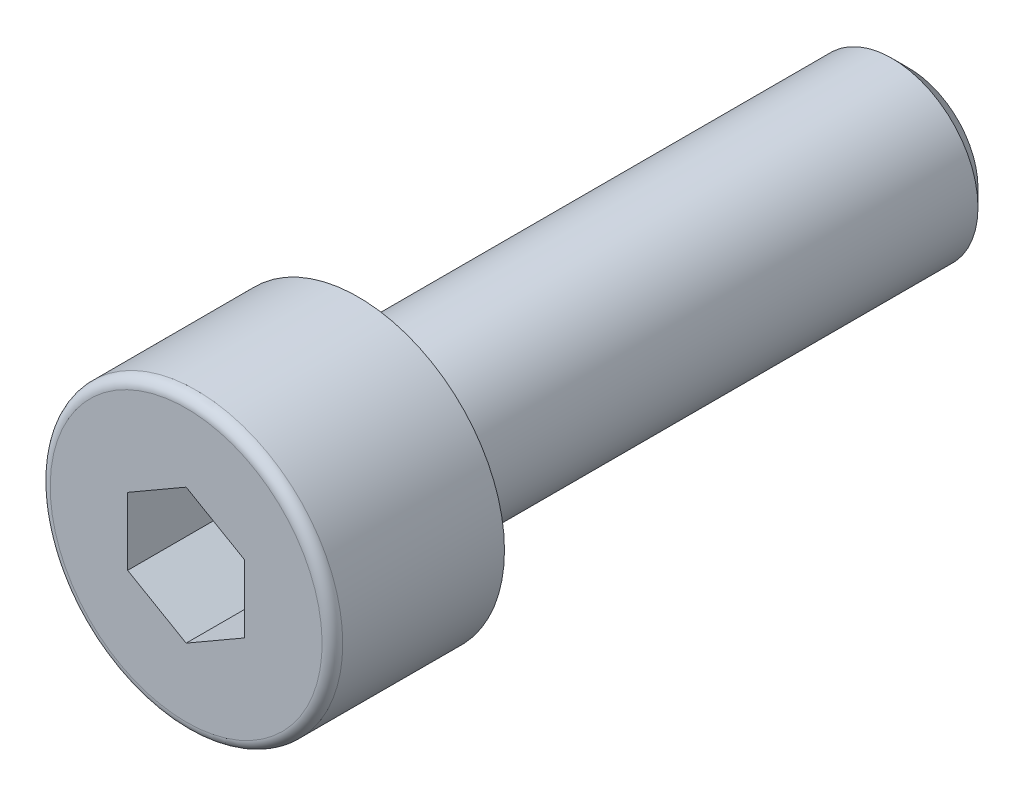
ISO-10303-21;
HEADER;
FILE_DESCRIPTION(('STEP AP214'),'2;1');
FILE_NAME('part.step','',(''),(''),'','','');
FILE_SCHEMA(('AUTOMOTIVE_DESIGN { 1 0 10303 214 1 1 1 1 }'));
ENDSEC;
DATA;
#1=APPLICATION_CONTEXT('core data for automotive mechanical design processes');
#2=APPLICATION_PROTOCOL_DEFINITION('international standard','automotive_design',2000,#1);
#3=PRODUCT_CONTEXT('',#1,'mechanical');
#4=PRODUCT('Part','Part','',(#3));
#5=PRODUCT_RELATED_PRODUCT_CATEGORY('part','',(#4));
#6=PRODUCT_DEFINITION_FORMATION('','',#4);
#7=PRODUCT_DEFINITION_CONTEXT('part definition',#1,'design');
#8=PRODUCT_DEFINITION('design','',#6,#7);
#9=PRODUCT_DEFINITION_SHAPE('','',#8);
#10=(LENGTH_UNIT() NAMED_UNIT(*) SI_UNIT(.MILLI.,.METRE.));
#11=(NAMED_UNIT(*) PLANE_ANGLE_UNIT() SI_UNIT($,.RADIAN.));
#12=(NAMED_UNIT(*) SI_UNIT($,.STERADIAN.) SOLID_ANGLE_UNIT());
#13=UNCERTAINTY_MEASURE_WITH_UNIT(LENGTH_MEASURE(1.E-05),#10,'distance_accuracy_value','');
#14=(GEOMETRIC_REPRESENTATION_CONTEXT(3) GLOBAL_UNCERTAINTY_ASSIGNED_CONTEXT((#13)) GLOBAL_UNIT_ASSIGNED_CONTEXT((#10,
#11,#12)) REPRESENTATION_CONTEXT('',''));
#15=CARTESIAN_POINT('',(0.,0.,0.));
#16=DIRECTION('',(0.,0.,1.));
#17=DIRECTION('',(1.,0.,0.));
#18=AXIS2_PLACEMENT_3D('',#15,#16,#17);
#19=CARTESIAN_POINT('',(-236.8,766.037009084756,-4.));
#20=DIRECTION('',(0.,0.,1.));
#21=DIRECTION('',(1.,0.,0.));
#22=AXIS2_PLACEMENT_3D('',#19,#20,#21);
#23=PLANE('',#22);
#24=DIRECTION('',(0.866025403784444,0.499999999999991,0.));
#25=VECTOR('',#24,1.);
#26=CARTESIAN_POINT('',(-238.5,769.962990915245,-4.));
#27=LINE('',#26,#25);
#28=CARTESIAN_POINT('',(-240.2,768.981495457623,-4.));
#29=VERTEX_POINT('',#28);
#30=CARTESIAN_POINT('',(-238.5,769.962990915245,-4.));
#31=VERTEX_POINT('',#30);
#32=EDGE_CURVE('E73',#29,#31,#27,.T.);
#33=ORIENTED_EDGE('',*,*,#32,.F.);
#34=DIRECTION('',(0.,1.,0.));
#35=VECTOR('',#34,1.);
#36=CARTESIAN_POINT('',(-240.2,767.018504542378,-4.));
#37=LINE('',#36,#35);
#38=CARTESIAN_POINT('',(-240.2,767.018504542378,-4.));
#39=VERTEX_POINT('',#38);
#40=EDGE_CURVE('E74',#39,#29,#37,.T.);
#41=ORIENTED_EDGE('',*,*,#40,.F.);
#42=DIRECTION('',(-0.866025403784444,0.499999999999991,0.));
#43=VECTOR('',#42,1.);
#44=CARTESIAN_POINT('',(-240.2,767.018504542378,-4.));
#45=LINE('',#44,#43);
#46=CARTESIAN_POINT('',(-238.5,766.037009084756,-4.));
#47=VERTEX_POINT('',#46);
#48=EDGE_CURVE('E263',#47,#39,#45,.T.);
#49=ORIENTED_EDGE('',*,*,#48,.F.);
#50=DIRECTION('',(-0.866025403784444,-0.499999999999991,0.));
#51=VECTOR('',#50,1.);
#52=CARTESIAN_POINT('',(-238.5,766.037009084756,-4.));
#53=LINE('',#52,#51);
#54=CARTESIAN_POINT('',(-236.8,767.018504542378,-4.));
#55=VERTEX_POINT('',#54);
#56=EDGE_CURVE('E268',#55,#47,#53,.T.);
#57=ORIENTED_EDGE('',*,*,#56,.F.);
#58=DIRECTION('',(0.,1.,0.));
#59=VECTOR('',#58,1.);
#60=CARTESIAN_POINT('',(-236.8,767.018504542378,-4.));
#61=LINE('',#60,#59);
#62=CARTESIAN_POINT('',(-236.8,768.981495457623,-4.));
#63=VERTEX_POINT('',#62);
#64=EDGE_CURVE('E273',#63,#55,#61,.F.);
#65=ORIENTED_EDGE('',*,*,#64,.F.);
#66=DIRECTION('',(0.866025403784444,-0.499999999999991,0.));
#67=VECTOR('',#66,1.);
#68=CARTESIAN_POINT('',(-236.8,768.981495457623,-4.));
#69=LINE('',#68,#67);
#70=EDGE_CURVE('E76',#31,#63,#69,.T.);
#71=ORIENTED_EDGE('',*,*,#70,.F.);
#72=EDGE_LOOP('',(#33,#41,#49,#57,#65,#71));
#73=FACE_BOUND('',#72,.T.);
#74=ADVANCED_FACE('F16',(#73),#23,.T.);
#75=CARTESIAN_POINT('',(-236.8,768.981495457623,-1.5));
#76=DIRECTION('',(-0.499999999999991,-0.866025403784444,0.));
#77=DIRECTION('',(0.866025403784444,-0.499999999999991,0.));
#78=AXIS2_PLACEMENT_3D('',#75,#76,#77);
#79=PLANE('',#78);
#80=DIRECTION('',(0.866025403784467,-0.499999999999951,0.));
#81=VECTOR('',#80,1.);
#82=CARTESIAN_POINT('',(-238.5,769.962990915245,-1.5));
#83=LINE('',#82,#81);
#84=CARTESIAN_POINT('',(-238.5,769.962990915245,-1.5));
#85=VERTEX_POINT('',#84);
#86=CARTESIAN_POINT('',(-236.8,768.981495457623,-1.5));
#87=VERTEX_POINT('',#86);
#88=EDGE_CURVE('E89',#85,#87,#83,.T.);
#89=ORIENTED_EDGE('',*,*,#88,.F.);
#90=DIRECTION('',(0.,0.,1.));
#91=VECTOR('',#90,1.);
#92=CARTESIAN_POINT('',(-238.5,769.962990915245,-1.5));
#93=LINE('',#92,#91);
#94=EDGE_CURVE('E80',#31,#85,#93,.T.);
#95=ORIENTED_EDGE('',*,*,#94,.F.);
#96=ORIENTED_EDGE('',*,*,#70,.T.);
#97=DIRECTION('',(0.,0.,1.));
#98=VECTOR('',#97,1.);
#99=CARTESIAN_POINT('',(-236.8,768.981495457623,-4.));
#100=LINE('',#99,#98);
#101=EDGE_CURVE('E271',#87,#63,#100,.F.);
#102=ORIENTED_EDGE('',*,*,#101,.F.);
#103=EDGE_LOOP('',(#89,#95,#96,#102));
#104=FACE_BOUND('',#103,.T.);
#105=ADVANCED_FACE('F171',(#104),#79,.T.);
#106=CARTESIAN_POINT('',(-236.8,767.018504542378,-4.));
#107=DIRECTION('',(-1.,0.,0.));
#108=DIRECTION('',(0.,0.,1.));
#109=AXIS2_PLACEMENT_3D('',#106,#107,#108);
#110=PLANE('',#109);
#111=DIRECTION('',(0.,1.,0.));
#112=VECTOR('',#111,1.);
#113=CARTESIAN_POINT('',(-236.8,764.05,-1.5));
#114=LINE('',#113,#112);
#115=CARTESIAN_POINT('',(-236.8,767.018504542378,-1.5));
#116=VERTEX_POINT('',#115);
#117=EDGE_CURVE('E92',#87,#116,#114,.F.);
#118=ORIENTED_EDGE('',*,*,#117,.F.);
#119=ORIENTED_EDGE('',*,*,#101,.T.);
#120=ORIENTED_EDGE('',*,*,#64,.T.);
#121=DIRECTION('',(0.,0.,1.));
#122=VECTOR('',#121,1.);
#123=CARTESIAN_POINT('',(-236.8,767.018504542378,-1.5));
#124=LINE('',#123,#122);
#125=EDGE_CURVE('E265',#116,#55,#124,.F.);
#126=ORIENTED_EDGE('',*,*,#125,.F.);
#127=EDGE_LOOP('',(#118,#119,#120,#126));
#128=FACE_BOUND('',#127,.T.);
#129=ADVANCED_FACE('F176',(#128),#110,.T.);
#130=CARTESIAN_POINT('',(-238.5,766.037009084756,-1.5));
#131=DIRECTION('',(-0.499999999999991,0.866025403784444,0.));
#132=DIRECTION('',(-0.866025403784444,-0.499999999999991,0.));
#133=AXIS2_PLACEMENT_3D('',#130,#131,#132);
#134=PLANE('',#133);
#135=DIRECTION('',(-0.866025403784442,-0.499999999999994,0.));
#136=VECTOR('',#135,1.);
#137=CARTESIAN_POINT('',(-236.8,767.018504542378,-1.5));
#138=LINE('',#137,#136);
#139=CARTESIAN_POINT('',(-238.5,766.037009084756,-1.5));
#140=VERTEX_POINT('',#139);
#141=EDGE_CURVE('E258',#116,#140,#138,.T.);
#142=ORIENTED_EDGE('',*,*,#141,.F.);
#143=ORIENTED_EDGE('',*,*,#125,.T.);
#144=ORIENTED_EDGE('',*,*,#56,.T.);
#145=DIRECTION('',(0.,0.,1.));
#146=VECTOR('',#145,1.);
#147=CARTESIAN_POINT('',(-238.5,766.037009084756,-1.5));
#148=LINE('',#147,#146);
#149=EDGE_CURVE('E83',#140,#47,#148,.F.);
#150=ORIENTED_EDGE('',*,*,#149,.F.);
#151=EDGE_LOOP('',(#142,#143,#144,#150));
#152=FACE_BOUND('',#151,.T.);
#153=ADVANCED_FACE('F181',(#152),#134,.T.);
#154=CARTESIAN_POINT('',(-240.2,767.018504542378,-1.5));
#155=DIRECTION('',(0.499999999999991,0.866025403784444,0.));
#156=DIRECTION('',(-0.866025403784444,0.499999999999991,0.));
#157=AXIS2_PLACEMENT_3D('',#154,#155,#156);
#158=PLANE('',#157);
#159=DIRECTION('',(-0.866025403784453,0.499999999999976,0.));
#160=VECTOR('',#159,1.);
#161=CARTESIAN_POINT('',(-238.5,766.037009084756,-1.5));
#162=LINE('',#161,#160);
#163=CARTESIAN_POINT('',(-240.2,767.018504542378,-1.5));
#164=VERTEX_POINT('',#163);
#165=EDGE_CURVE('E257',#140,#164,#162,.T.);
#166=ORIENTED_EDGE('',*,*,#165,.F.);
#167=ORIENTED_EDGE('',*,*,#149,.T.);
#168=ORIENTED_EDGE('',*,*,#48,.T.);
#169=DIRECTION('',(0.,0.,-1.));
#170=VECTOR('',#169,1.);
#171=CARTESIAN_POINT('',(-240.2,767.018504542378,-1.5));
#172=LINE('',#171,#170);
#173=EDGE_CURVE('E41',#164,#39,#172,.T.);
#174=ORIENTED_EDGE('',*,*,#173,.F.);
#175=EDGE_LOOP('',(#166,#167,#168,#174));
#176=FACE_BOUND('',#175,.T.);
#177=ADVANCED_FACE('F199',(#176),#158,.T.);
#178=CARTESIAN_POINT('',(-240.2,767.018504542378,-1.5));
#179=DIRECTION('',(1.,0.,0.));
#180=DIRECTION('',(0.,0.,-1.));
#181=AXIS2_PLACEMENT_3D('',#178,#179,#180);
#182=PLANE('',#181);
#183=DIRECTION('',(0.,1.,0.));
#184=VECTOR('',#183,1.);
#185=CARTESIAN_POINT('',(-240.2,764.05,-1.5));
#186=LINE('',#185,#184);
#187=CARTESIAN_POINT('',(-240.2,768.981495457623,-1.5));
#188=VERTEX_POINT('',#187);
#189=EDGE_CURVE('E97',#164,#188,#186,.T.);
#190=ORIENTED_EDGE('',*,*,#189,.F.);
#191=ORIENTED_EDGE('',*,*,#173,.T.);
#192=ORIENTED_EDGE('',*,*,#40,.T.);
#193=DIRECTION('',(0.,0.,1.));
#194=VECTOR('',#193,1.);
#195=CARTESIAN_POINT('',(-240.2,768.981495457623,-1.5));
#196=LINE('',#195,#194);
#197=EDGE_CURVE('E33',#188,#29,#196,.F.);
#198=ORIENTED_EDGE('',*,*,#197,.F.);
#199=EDGE_LOOP('',(#190,#191,#192,#198));
#200=FACE_BOUND('',#199,.T.);
#201=ADVANCED_FACE('F82',(#200),#182,.T.);
#202=CARTESIAN_POINT('',(-238.5,769.962990915245,-1.5));
#203=DIRECTION('',(0.499999999999991,-0.866025403784444,0.));
#204=DIRECTION('',(0.866025403784444,0.499999999999991,0.));
#205=AXIS2_PLACEMENT_3D('',#202,#203,#204);
#206=PLANE('',#205);
#207=DIRECTION('',(0.866025403784453,0.499999999999976,0.));
#208=VECTOR('',#207,1.);
#209=CARTESIAN_POINT('',(-240.2,768.981495457623,-1.5));
#210=LINE('',#209,#208);
#211=EDGE_CURVE('E87',#188,#85,#210,.T.);
#212=ORIENTED_EDGE('',*,*,#211,.F.);
#213=ORIENTED_EDGE('',*,*,#197,.T.);
#214=ORIENTED_EDGE('',*,*,#32,.T.);
#215=ORIENTED_EDGE('',*,*,#94,.T.);
#216=EDGE_LOOP('',(#212,#213,#214,#215));
#217=FACE_BOUND('',#216,.T.);
#218=ADVANCED_FACE('F85',(#217),#206,.T.);
#219=CARTESIAN_POINT('',(-234.55,764.05,-1.5));
#220=DIRECTION('',(0.,0.,1.));
#221=DIRECTION('',(1.,0.,0.));
#222=AXIS2_PLACEMENT_3D('',#219,#220,#221);
#223=PLANE('',#222);
#224=CARTESIAN_POINT('',(-238.5,768.,-1.49999999999997));
#225=DIRECTION('',(0.,0.,1.));
#226=DIRECTION('',(0.,-1.,0.));
#227=AXIS2_PLACEMENT_3D('',#224,#225,#226);
#228=CIRCLE('',#227,3.94999999999977);
#229=CARTESIAN_POINT('',(-238.5,764.050000000001,-1.49999999999997));
#230=VERTEX_POINT('',#229);
#231=EDGE_CURVE('E20',#230,#230,#228,.F.);
#232=ORIENTED_EDGE('',*,*,#231,.F.);
#233=EDGE_LOOP('',(#232));
#234=FACE_BOUND('',#233,.T.);
#235=ORIENTED_EDGE('',*,*,#189,.T.);
#236=ORIENTED_EDGE('',*,*,#211,.T.);
#237=ORIENTED_EDGE('',*,*,#88,.T.);
#238=ORIENTED_EDGE('',*,*,#117,.T.);
#239=ORIENTED_EDGE('',*,*,#141,.T.);
#240=ORIENTED_EDGE('',*,*,#165,.T.);
#241=EDGE_LOOP('',(#235,#236,#237,#238,#239,#240));
#242=FACE_BOUND('',#241,.T.);
#243=ADVANCED_FACE('F125',(#234,#242),#223,.T.);
#244=CARTESIAN_POINT('',(-238.5,768.,-1.79999999999991));
#245=DIRECTION('',(0.,0.,1.));
#246=DIRECTION('',(0.,-1.,0.));
#247=AXIS2_PLACEMENT_3D('',#244,#245,#246);
#248=TOROIDAL_SURFACE('',#247,3.95000000000025,0.299999999999941);
#249=CARTESIAN_POINT('',(-238.5,768.,-1.79999999999997));
#250=DIRECTION('',(0.,0.,1.));
#251=DIRECTION('',(1.,0.,0.));
#252=AXIS2_PLACEMENT_3D('',#249,#250,#251);
#253=CIRCLE('',#252,4.25);
#254=CARTESIAN_POINT('',(-234.25,768.,-1.79999999999997));
#255=VERTEX_POINT('',#254);
#256=EDGE_CURVE('E100',#255,#255,#253,.F.);
#257=ORIENTED_EDGE('',*,*,#256,.F.);
#258=EDGE_LOOP('',(#257));
#259=FACE_BOUND('',#258,.T.);
#260=ORIENTED_EDGE('',*,*,#231,.T.);
#261=EDGE_LOOP('',(#260));
#262=FACE_BOUND('',#261,.T.);
#263=ADVANCED_FACE('F116',(#259,#262),#248,.T.);
#264=CARTESIAN_POINT('',(-240.5095,765.9905,-22.5));
#265=DIRECTION('',(0.,0.,-1.));
#266=DIRECTION('',(-1.,0.,0.));
#267=AXIS2_PLACEMENT_3D('',#264,#265,#266);
#268=PLANE('',#267);
#269=CARTESIAN_POINT('',(-238.5,768.,-22.4999999999795));
#270=DIRECTION('',(0.,0.,1.));
#271=DIRECTION('',(1.,0.,0.));
#272=AXIS2_PLACEMENT_3D('',#269,#270,#271);
#273=CIRCLE('',#272,2.00950000005487);
#274=CARTESIAN_POINT('',(-236.490499999945,768.,-22.4999999999795));
#275=VERTEX_POINT('',#274);
#276=EDGE_CURVE('E103',#275,#275,#273,.T.);
#277=ORIENTED_EDGE('',*,*,#276,.F.);
#278=EDGE_LOOP('',(#277));
#279=FACE_BOUND('',#278,.T.);
#280=ADVANCED_FACE('F113',(#279),#268,.T.);
#281=CARTESIAN_POINT('',(-238.5,768.,-1.5));
#282=DIRECTION('',(0.,0.,1.));
#283=DIRECTION('',(1.,0.,0.));
#284=AXIS2_PLACEMENT_3D('',#281,#282,#283);
#285=CYLINDRICAL_SURFACE('',#284,4.25);
#286=ORIENTED_EDGE('',*,*,#256,.T.);
#287=EDGE_LOOP('',(#286));
#288=FACE_BOUND('',#287,.T.);
#289=CARTESIAN_POINT('',(-238.5,768.,-6.50000000000001));
#290=DIRECTION('',(0.,0.,1.));
#291=DIRECTION('',(1.,0.,0.));
#292=AXIS2_PLACEMENT_3D('',#289,#290,#291);
#293=CIRCLE('',#292,4.25);
#294=CARTESIAN_POINT('',(-234.25,768.,-6.50000000000001));
#295=VERTEX_POINT('',#294);
#296=EDGE_CURVE('E104',#295,#295,#293,.F.);
#297=ORIENTED_EDGE('',*,*,#296,.F.);
#298=EDGE_LOOP('',(#297));
#299=FACE_BOUND('',#298,.T.);
#300=ADVANCED_FACE('F115',(#288,#299),#285,.T.);
#301=CARTESIAN_POINT('',(-238.5,768.,-22.0095000000811));
#302=DIRECTION('',(0.,0.,1.));
#303=DIRECTION('',(1.,0.,0.));
#304=AXIS2_PLACEMENT_3D('',#301,#302,#303);
#305=CONICAL_SURFACE('',#304,2.49999999995334,0.785398163397448);
#306=CARTESIAN_POINT('',(-238.5,768.,-22.0095));
#307=DIRECTION('',(0.,0.,1.));
#308=DIRECTION('',(1.,0.,0.));
#309=AXIS2_PLACEMENT_3D('',#306,#307,#308);
#310=CIRCLE('',#309,2.5);
#311=CARTESIAN_POINT('',(-236.,768.,-22.0095));
#312=VERTEX_POINT('',#311);
#313=EDGE_CURVE('E25',#312,#312,#310,.T.);
#314=ORIENTED_EDGE('',*,*,#313,.F.);
#315=EDGE_LOOP('',(#314));
#316=FACE_BOUND('',#315,.T.);
#317=ORIENTED_EDGE('',*,*,#276,.T.);
#318=EDGE_LOOP('',(#317));
#319=FACE_BOUND('',#318,.T.);
#320=ADVANCED_FACE('F111',(#316,#319),#305,.T.);
#321=CARTESIAN_POINT('',(-242.75,763.75,-6.50000000000001));
#322=DIRECTION('',(0.,0.,-1.));
#323=DIRECTION('',(-1.,0.,0.));
#324=AXIS2_PLACEMENT_3D('',#321,#322,#323);
#325=PLANE('',#324);
#326=ORIENTED_EDGE('',*,*,#296,.T.);
#327=EDGE_LOOP('',(#326));
#328=FACE_BOUND('',#327,.T.);
#329=CARTESIAN_POINT('',(-238.5,768.,-6.50000000000001));
#330=DIRECTION('',(0.,0.,1.));
#331=DIRECTION('',(1.,0.,0.));
#332=AXIS2_PLACEMENT_3D('',#329,#330,#331);
#333=CIRCLE('',#332,2.5);
#334=CARTESIAN_POINT('',(-236.,768.,-6.50000000000001));
#335=VERTEX_POINT('',#334);
#336=EDGE_CURVE('E11',#335,#335,#333,.F.);
#337=ORIENTED_EDGE('',*,*,#336,.F.);
#338=EDGE_LOOP('',(#337));
#339=FACE_BOUND('',#338,.T.);
#340=ADVANCED_FACE('F130',(#328,#339),#325,.T.);
#341=CARTESIAN_POINT('',(-238.5,768.,-1.5));
#342=DIRECTION('',(0.,0.,1.));
#343=DIRECTION('',(1.,0.,0.));
#344=AXIS2_PLACEMENT_3D('',#341,#342,#343);
#345=CYLINDRICAL_SURFACE('',#344,2.5);
#346=ORIENTED_EDGE('',*,*,#336,.T.);
#347=EDGE_LOOP('',(#346));
#348=FACE_BOUND('',#347,.T.);
#349=ORIENTED_EDGE('',*,*,#313,.T.);
#350=EDGE_LOOP('',(#349));
#351=FACE_BOUND('',#350,.T.);
#352=ADVANCED_FACE('F18',(#348,#351),#345,.T.);
#353=CLOSED_SHELL('',(#74,#105,#129,#153,#177,#201,#218,#243,#263,#280,#300,#320,#340,#352));
#354=MANIFOLD_SOLID_BREP('B1',#353);
#355=ADVANCED_BREP_SHAPE_REPRESENTATION('',(#18,#354),#14);
#356=SHAPE_DEFINITION_REPRESENTATION(#9,#355);
ENDSEC;
END-ISO-10303-21;
